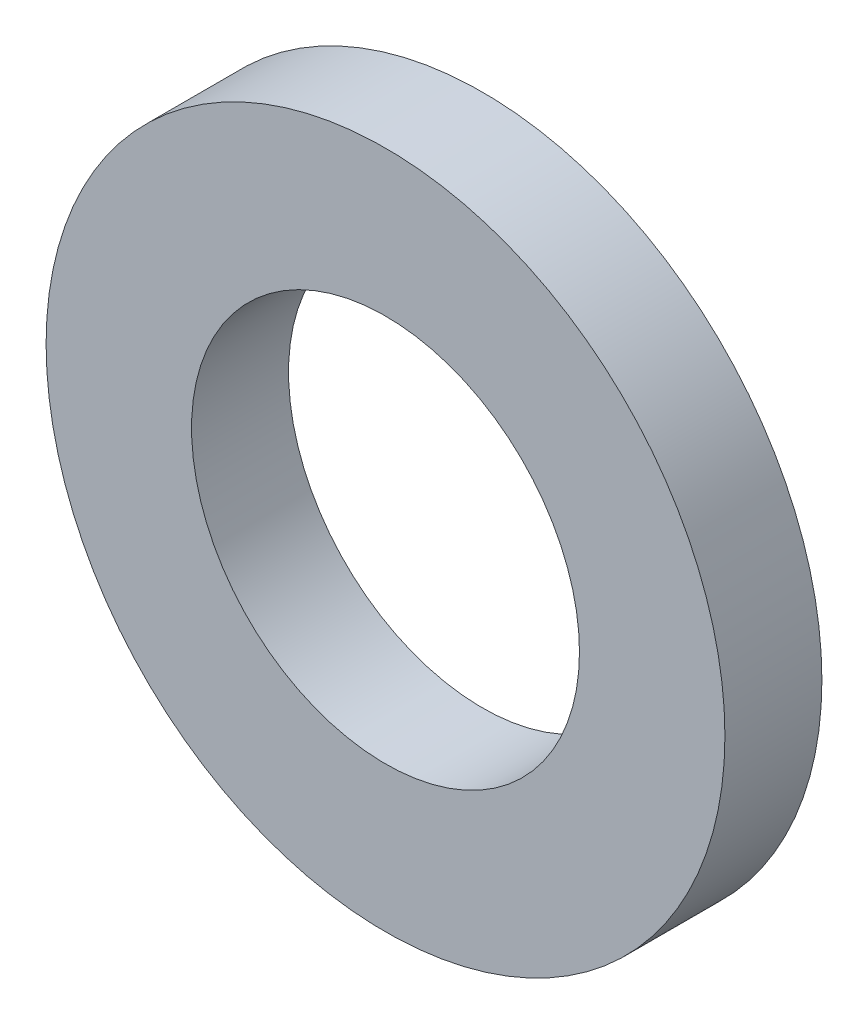
ISO-10303-21;
HEADER;
FILE_DESCRIPTION(('STEP AP214'),'2;1');
FILE_NAME('part.step','',(''),(''),'','','');
FILE_SCHEMA(('AUTOMOTIVE_DESIGN { 1 0 10303 214 1 1 1 1 }'));
ENDSEC;
DATA;
#1=APPLICATION_CONTEXT('core data for automotive mechanical design processes');
#2=APPLICATION_PROTOCOL_DEFINITION('international standard','automotive_design',2000,#1);
#3=PRODUCT_CONTEXT('',#1,'mechanical');
#4=PRODUCT('Part','Part','',(#3));
#5=PRODUCT_RELATED_PRODUCT_CATEGORY('part','',(#4));
#6=PRODUCT_DEFINITION_FORMATION('','',#4);
#7=PRODUCT_DEFINITION_CONTEXT('part definition',#1,'design');
#8=PRODUCT_DEFINITION('design','',#6,#7);
#9=PRODUCT_DEFINITION_SHAPE('','',#8);
#10=(LENGTH_UNIT() NAMED_UNIT(*) SI_UNIT(.MILLI.,.METRE.));
#11=(NAMED_UNIT(*) PLANE_ANGLE_UNIT() SI_UNIT($,.RADIAN.));
#12=(NAMED_UNIT(*) SI_UNIT($,.STERADIAN.) SOLID_ANGLE_UNIT());
#13=UNCERTAINTY_MEASURE_WITH_UNIT(LENGTH_MEASURE(1.E-05),#10,'distance_accuracy_value','');
#14=(GEOMETRIC_REPRESENTATION_CONTEXT(3) GLOBAL_UNCERTAINTY_ASSIGNED_CONTEXT((#13)) GLOBAL_UNIT_ASSIGNED_CONTEXT((#10,
#11,#12)) REPRESENTATION_CONTEXT('',''));
#15=CARTESIAN_POINT('',(0.,0.,0.));
#16=DIRECTION('',(0.,0.,1.));
#17=DIRECTION('',(1.,0.,0.));
#18=AXIS2_PLACEMENT_3D('',#15,#16,#17);
#19=CARTESIAN_POINT('',(0.,0.,1.));
#20=DIRECTION('',(0.,0.,1.));
#21=DIRECTION('',(1.,0.,0.));
#22=AXIS2_PLACEMENT_3D('',#19,#20,#21);
#23=PLANE('',#22);
#24=CARTESIAN_POINT('',(0.,0.,1.));
#25=DIRECTION('',(0.,0.,1.));
#26=DIRECTION('',(1.,0.,0.));
#27=AXIS2_PLACEMENT_3D('',#24,#25,#26);
#28=CIRCLE('',#27,3.5);
#29=CARTESIAN_POINT('',(3.5,0.,1.));
#30=VERTEX_POINT('',#29);
#31=EDGE_CURVE('E10',#30,#30,#28,.T.);
#32=ORIENTED_EDGE('',*,*,#31,.T.);
#33=EDGE_LOOP('',(#32));
#34=FACE_BOUND('',#33,.T.);
#35=CARTESIAN_POINT('',(0.,0.,1.));
#36=DIRECTION('',(0.,0.,1.));
#37=DIRECTION('',(1.,0.,0.));
#38=AXIS2_PLACEMENT_3D('',#35,#36,#37);
#39=CIRCLE('',#38,2.);
#40=CARTESIAN_POINT('',(2.,0.,1.));
#41=VERTEX_POINT('',#40);
#42=EDGE_CURVE('E46',#41,#41,#39,.T.);
#43=ORIENTED_EDGE('',*,*,#42,.F.);
#44=EDGE_LOOP('',(#43));
#45=FACE_BOUND('',#44,.T.);
#46=ADVANCED_FACE('F35',(#34,#45),#23,.T.);
#47=CARTESIAN_POINT('',(0.,0.,0.));
#48=DIRECTION('',(0.,0.,1.));
#49=DIRECTION('',(1.,0.,0.));
#50=AXIS2_PLACEMENT_3D('',#47,#48,#49);
#51=PLANE('',#50);
#52=CARTESIAN_POINT('',(0.,0.,0.));
#53=DIRECTION('',(0.,0.,1.));
#54=DIRECTION('',(1.,0.,0.));
#55=AXIS2_PLACEMENT_3D('',#52,#53,#54);
#56=CIRCLE('',#55,3.5);
#57=CARTESIAN_POINT('',(3.5,0.,0.));
#58=VERTEX_POINT('',#57);
#59=EDGE_CURVE('E39',#58,#58,#56,.T.);
#60=ORIENTED_EDGE('',*,*,#59,.F.);
#61=EDGE_LOOP('',(#60));
#62=FACE_BOUND('',#61,.T.);
#63=CARTESIAN_POINT('',(0.,0.,0.));
#64=DIRECTION('',(0.,0.,1.));
#65=DIRECTION('',(1.,0.,0.));
#66=AXIS2_PLACEMENT_3D('',#63,#64,#65);
#67=CIRCLE('',#66,2.);
#68=CARTESIAN_POINT('',(2.,0.,0.));
#69=VERTEX_POINT('',#68);
#70=EDGE_CURVE('E48',#69,#69,#67,.T.);
#71=ORIENTED_EDGE('',*,*,#70,.T.);
#72=EDGE_LOOP('',(#71));
#73=FACE_BOUND('',#72,.T.);
#74=ADVANCED_FACE('F58',(#62,#73),#51,.F.);
#75=CARTESIAN_POINT('',(0.,0.,1.));
#76=DIRECTION('',(0.,0.,-1.));
#77=DIRECTION('',(-1.,0.,0.));
#78=AXIS2_PLACEMENT_3D('',#75,#76,#77);
#79=CYLINDRICAL_SURFACE('',#78,3.5);
#80=ORIENTED_EDGE('',*,*,#31,.F.);
#81=EDGE_LOOP('',(#80));
#82=FACE_BOUND('',#81,.T.);
#83=ORIENTED_EDGE('',*,*,#59,.T.);
#84=EDGE_LOOP('',(#83));
#85=FACE_BOUND('',#84,.T.);
#86=ADVANCED_FACE('F37',(#82,#85),#79,.T.);
#87=CARTESIAN_POINT('',(0.,0.,1.));
#88=DIRECTION('',(0.,0.,-1.));
#89=DIRECTION('',(-1.,0.,0.));
#90=AXIS2_PLACEMENT_3D('',#87,#88,#89);
#91=CYLINDRICAL_SURFACE('',#90,2.);
#92=ORIENTED_EDGE('',*,*,#42,.T.);
#93=EDGE_LOOP('',(#92));
#94=FACE_BOUND('',#93,.T.);
#95=ORIENTED_EDGE('',*,*,#70,.F.);
#96=EDGE_LOOP('',(#95));
#97=FACE_BOUND('',#96,.T.);
#98=ADVANCED_FACE('F54',(#94,#97),#91,.F.);
#99=CLOSED_SHELL('',(#46,#74,#86,#98));
#100=MANIFOLD_SOLID_BREP('B2',#99);
#101=ADVANCED_BREP_SHAPE_REPRESENTATION('',(#18,#100),#14);
#102=SHAPE_DEFINITION_REPRESENTATION(#9,#101);
ENDSEC;
END-ISO-10303-21;
